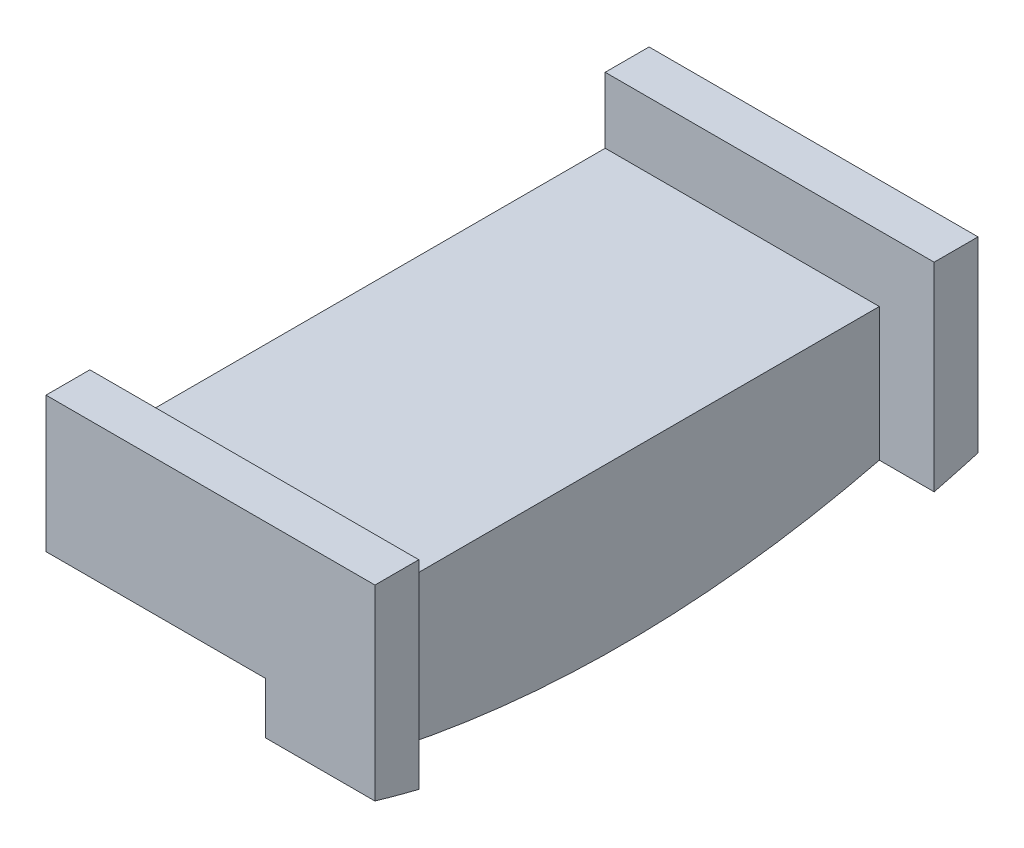
ISO-10303-21;
HEADER;
FILE_DESCRIPTION(('STEP AP214'),'2;1');
FILE_NAME('part.step','',(''),(''),'','','');
FILE_SCHEMA(('AUTOMOTIVE_DESIGN { 1 0 10303 214 1 1 1 1 }'));
ENDSEC;
DATA;
#1=APPLICATION_CONTEXT('core data for automotive mechanical design processes');
#2=APPLICATION_PROTOCOL_DEFINITION('international standard','automotive_design',2000,#1);
#3=PRODUCT_CONTEXT('',#1,'mechanical');
#4=PRODUCT('Part','Part','',(#3));
#5=PRODUCT_RELATED_PRODUCT_CATEGORY('part','',(#4));
#6=PRODUCT_DEFINITION_FORMATION('','',#4);
#7=PRODUCT_DEFINITION_CONTEXT('part definition',#1,'design');
#8=PRODUCT_DEFINITION('design','',#6,#7);
#9=PRODUCT_DEFINITION_SHAPE('','',#8);
#10=(LENGTH_UNIT() NAMED_UNIT(*) SI_UNIT(.MILLI.,.METRE.));
#11=(NAMED_UNIT(*) PLANE_ANGLE_UNIT() SI_UNIT($,.RADIAN.));
#12=(NAMED_UNIT(*) SI_UNIT($,.STERADIAN.) SOLID_ANGLE_UNIT());
#13=UNCERTAINTY_MEASURE_WITH_UNIT(LENGTH_MEASURE(1.E-05),#10,'distance_accuracy_value','');
#14=(GEOMETRIC_REPRESENTATION_CONTEXT(3) GLOBAL_UNCERTAINTY_ASSIGNED_CONTEXT((#13)) GLOBAL_UNIT_ASSIGNED_CONTEXT((#10,
#11,#12)) REPRESENTATION_CONTEXT('',''));
#15=CARTESIAN_POINT('',(0.,0.,0.));
#16=DIRECTION('',(0.,0.,1.));
#17=DIRECTION('',(1.,0.,0.));
#18=AXIS2_PLACEMENT_3D('',#15,#16,#17);
#19=CARTESIAN_POINT('',(26.18,-4.85,-1.375));
#20=DIRECTION('',(0.,0.,1.));
#21=DIRECTION('',(1.,0.,0.));
#22=AXIS2_PLACEMENT_3D('',#19,#20,#21);
#23=PLANE('',#22);
#24=DIRECTION('',(0.,1.,0.));
#25=VECTOR('',#24,1.);
#26=CARTESIAN_POINT('',(26.43,5.675,-1.375));
#27=LINE('',#26,#25);
#28=CARTESIAN_POINT('',(26.43,-4.70312396179391,-1.375));
#29=VERTEX_POINT('',#28);
#30=CARTESIAN_POINT('',(26.43,-4.46822112254978,-1.375));
#31=VERTEX_POINT('',#30);
#32=EDGE_CURVE('E101',#29,#31,#27,.T.);
#33=ORIENTED_EDGE('',*,*,#32,.T.);
#34=DIRECTION('',(1.,0.,0.));
#35=VECTOR('',#34,1.);
#36=CARTESIAN_POINT('',(25.68,-4.46822112254978,-1.375));
#37=LINE('',#36,#35);
#38=CARTESIAN_POINT('',(25.43,-4.46822112254978,-1.375));
#39=VERTEX_POINT('',#38);
#40=EDGE_CURVE('E160',#39,#31,#37,.T.);
#41=ORIENTED_EDGE('',*,*,#40,.F.);
#42=DIRECTION('',(0.,1.,0.));
#43=VECTOR('',#42,1.);
#44=CARTESIAN_POINT('',(25.43,-4.85,-1.375));
#45=LINE('',#44,#43);
#46=CARTESIAN_POINT('',(25.43,-3.85,-1.375));
#47=VERTEX_POINT('',#46);
#48=EDGE_CURVE('E135',#47,#39,#45,.F.);
#49=ORIENTED_EDGE('',*,*,#48,.F.);
#50=DIRECTION('',(1.,0.,0.));
#51=VECTOR('',#50,1.);
#52=CARTESIAN_POINT('',(26.18,-3.85,-1.375));
#53=LINE('',#52,#51);
#54=CARTESIAN_POINT('',(26.93,-3.85,-1.375));
#55=VERTEX_POINT('',#54);
#56=EDGE_CURVE('E139',#47,#55,#53,.T.);
#57=ORIENTED_EDGE('',*,*,#56,.T.);
#58=DIRECTION('',(0.,1.,0.));
#59=VECTOR('',#58,1.);
#60=CARTESIAN_POINT('',(26.93,-4.85,-1.375));
#61=LINE('',#60,#59);
#62=CARTESIAN_POINT('',(26.93,-4.70312396179391,-1.375));
#63=VERTEX_POINT('',#62);
#64=EDGE_CURVE('E162',#63,#55,#61,.T.);
#65=ORIENTED_EDGE('',*,*,#64,.F.);
#66=DIRECTION('',(-1.,0.,0.));
#67=VECTOR('',#66,1.);
#68=CARTESIAN_POINT('',(27.18,-4.70312396179391,-1.375));
#69=LINE('',#68,#67);
#70=EDGE_CURVE('E111',#29,#63,#69,.F.);
#71=ORIENTED_EDGE('',*,*,#70,.F.);
#72=EDGE_LOOP('',(#33,#41,#49,#57,#65,#71));
#73=FACE_BOUND('',#72,.T.);
#74=ADVANCED_FACE('F16',(#73),#23,.F.);
#75=CARTESIAN_POINT('',(26.43,5.675,0.));
#76=DIRECTION('',(1.,0.,0.));
#77=DIRECTION('',(0.,0.,-1.));
#78=AXIS2_PLACEMENT_3D('',#75,#76,#77);
#79=PLANE('',#78);
#80=CARTESIAN_POINT('',(26.43,0.,0.));
#81=DIRECTION('',(-1.,0.,0.));
#82=DIRECTION('',(0.,0.,1.));
#83=AXIS2_PLACEMENT_3D('',#80,#81,#82);
#84=CIRCLE('',#83,4.9);
#85=CARTESIAN_POINT('',(26.43,-4.70312396179391,1.375));
#86=VERTEX_POINT('',#85);
#87=EDGE_CURVE('E19',#86,#29,#84,.F.);
#88=ORIENTED_EDGE('',*,*,#87,.F.);
#89=DIRECTION('',(0.,1.,0.));
#90=VECTOR('',#89,1.);
#91=CARTESIAN_POINT('',(26.43,-4.85,1.375));
#92=LINE('',#91,#90);
#93=CARTESIAN_POINT('',(26.43,-4.46822112254978,1.375));
#94=VERTEX_POINT('',#93);
#95=EDGE_CURVE('E107',#86,#94,#92,.T.);
#96=ORIENTED_EDGE('',*,*,#95,.T.);
#97=CARTESIAN_POINT('',(26.43,0.,0.));
#98=DIRECTION('',(1.,0.,0.));
#99=DIRECTION('',(0.,0.,-1.));
#100=AXIS2_PLACEMENT_3D('',#97,#98,#99);
#101=CIRCLE('',#100,4.675);
#102=EDGE_CURVE('E158',#31,#94,#101,.F.);
#103=ORIENTED_EDGE('',*,*,#102,.F.);
#104=ORIENTED_EDGE('',*,*,#32,.F.);
#105=EDGE_LOOP('',(#88,#96,#103,#104));
#106=FACE_BOUND('',#105,.T.);
#107=ADVANCED_FACE('F106',(#106),#79,.F.);
#108=CARTESIAN_POINT('',(26.18,-4.85,1.375));
#109=DIRECTION('',(0.,0.,-1.));
#110=DIRECTION('',(-1.,0.,0.));
#111=AXIS2_PLACEMENT_3D('',#108,#109,#110);
#112=PLANE('',#111);
#113=DIRECTION('',(0.,1.,0.));
#114=VECTOR('',#113,1.);
#115=CARTESIAN_POINT('',(26.93,-4.85,1.375));
#116=LINE('',#115,#114);
#117=CARTESIAN_POINT('',(26.93,-3.85,1.375));
#118=VERTEX_POINT('',#117);
#119=CARTESIAN_POINT('',(26.93,-4.70312396179391,1.375));
#120=VERTEX_POINT('',#119);
#121=EDGE_CURVE('E157',#118,#120,#116,.F.);
#122=ORIENTED_EDGE('',*,*,#121,.F.);
#123=DIRECTION('',(1.,0.,0.));
#124=VECTOR('',#123,1.);
#125=CARTESIAN_POINT('',(26.18,-3.85,1.375));
#126=LINE('',#125,#124);
#127=CARTESIAN_POINT('',(25.43,-3.85,1.375));
#128=VERTEX_POINT('',#127);
#129=EDGE_CURVE('E159',#118,#128,#126,.F.);
#130=ORIENTED_EDGE('',*,*,#129,.T.);
#131=DIRECTION('',(0.,1.,0.));
#132=VECTOR('',#131,1.);
#133=CARTESIAN_POINT('',(25.43,-4.85,1.375));
#134=LINE('',#133,#132);
#135=CARTESIAN_POINT('',(25.43,-4.46822112254978,1.375));
#136=VERTEX_POINT('',#135);
#137=EDGE_CURVE('E120',#136,#128,#134,.T.);
#138=ORIENTED_EDGE('',*,*,#137,.F.);
#139=DIRECTION('',(1.,0.,0.));
#140=VECTOR('',#139,1.);
#141=CARTESIAN_POINT('',(25.68,-4.46822112254978,1.375));
#142=LINE('',#141,#140);
#143=EDGE_CURVE('E119',#94,#136,#142,.F.);
#144=ORIENTED_EDGE('',*,*,#143,.F.);
#145=ORIENTED_EDGE('',*,*,#95,.F.);
#146=DIRECTION('',(-1.,0.,0.));
#147=VECTOR('',#146,1.);
#148=CARTESIAN_POINT('',(27.18,-4.70312396179391,1.375));
#149=LINE('',#148,#147);
#150=EDGE_CURVE('E112',#120,#86,#149,.T.);
#151=ORIENTED_EDGE('',*,*,#150,.F.);
#152=EDGE_LOOP('',(#122,#130,#138,#144,#145,#151));
#153=FACE_BOUND('',#152,.T.);
#154=ADVANCED_FACE('F115',(#153),#112,.F.);
#155=CARTESIAN_POINT('',(27.18,0.,0.));
#156=DIRECTION('',(-1.,0.,0.));
#157=DIRECTION('',(0.,0.,1.));
#158=AXIS2_PLACEMENT_3D('',#155,#156,#157);
#159=CYLINDRICAL_SURFACE('',#158,4.9);
#160=DIRECTION('',(-1.,0.,0.));
#161=VECTOR('',#160,1.);
#162=CARTESIAN_POINT('',(27.18,-4.75703426516984,-1.175));
#163=LINE('',#162,#161);
#164=CARTESIAN_POINT('',(26.93,-4.75703426516984,-1.175));
#165=VERTEX_POINT('',#164);
#166=CARTESIAN_POINT('',(26.68,-4.75703426516984,-1.175));
#167=VERTEX_POINT('',#166);
#168=EDGE_CURVE('E146',#165,#167,#163,.T.);
#169=ORIENTED_EDGE('',*,*,#168,.T.);
#170=CARTESIAN_POINT('',(26.68,0.,0.));
#171=DIRECTION('',(-1.,0.,0.));
#172=DIRECTION('',(0.,0.,1.));
#173=AXIS2_PLACEMENT_3D('',#170,#171,#172);
#174=CIRCLE('',#173,4.9);
#175=CARTESIAN_POINT('',(26.68,-4.75703426516984,1.175));
#176=VERTEX_POINT('',#175);
#177=EDGE_CURVE('E152',#176,#167,#174,.F.);
#178=ORIENTED_EDGE('',*,*,#177,.F.);
#179=DIRECTION('',(-1.,0.,0.));
#180=VECTOR('',#179,1.);
#181=CARTESIAN_POINT('',(27.18,-4.75703426516984,1.175));
#182=LINE('',#181,#180);
#183=CARTESIAN_POINT('',(26.93,-4.75703426516984,1.175));
#184=VERTEX_POINT('',#183);
#185=EDGE_CURVE('E126',#176,#184,#182,.F.);
#186=ORIENTED_EDGE('',*,*,#185,.T.);
#187=CARTESIAN_POINT('',(26.93,0.,0.));
#188=DIRECTION('',(-1.,0.,0.));
#189=DIRECTION('',(0.,0.,1.));
#190=AXIS2_PLACEMENT_3D('',#187,#188,#189);
#191=CIRCLE('',#190,4.9);
#192=EDGE_CURVE('E124',#120,#184,#191,.F.);
#193=ORIENTED_EDGE('',*,*,#192,.F.);
#194=ORIENTED_EDGE('',*,*,#150,.T.);
#195=ORIENTED_EDGE('',*,*,#87,.T.);
#196=ORIENTED_EDGE('',*,*,#70,.T.);
#197=CARTESIAN_POINT('',(26.93,0.,0.));
#198=DIRECTION('',(-1.,0.,0.));
#199=DIRECTION('',(0.,0.,1.));
#200=AXIS2_PLACEMENT_3D('',#197,#198,#199);
#201=CIRCLE('',#200,4.9);
#202=EDGE_CURVE('E141',#165,#63,#201,.F.);
#203=ORIENTED_EDGE('',*,*,#202,.F.);
#204=EDGE_LOOP('',(#169,#178,#186,#193,#194,#195,#196,#203));
#205=FACE_BOUND('',#204,.T.);
#206=ADVANCED_FACE('F122',(#205),#159,.T.);
#207=CARTESIAN_POINT('',(26.18,-3.85,0.));
#208=DIRECTION('',(0.,-1.,0.));
#209=DIRECTION('',(0.,0.,-1.));
#210=AXIS2_PLACEMENT_3D('',#207,#208,#209);
#211=PLANE('',#210);
#212=DIRECTION('',(0.,0.,-1.));
#213=VECTOR('',#212,1.);
#214=CARTESIAN_POINT('',(26.93,-3.85,0.));
#215=LINE('',#214,#213);
#216=CARTESIAN_POINT('',(26.93,-3.85,-1.175));
#217=VERTEX_POINT('',#216);
#218=EDGE_CURVE('E167',#55,#217,#215,.F.);
#219=ORIENTED_EDGE('',*,*,#218,.F.);
#220=ORIENTED_EDGE('',*,*,#56,.F.);
#221=DIRECTION('',(0.,0.,-1.));
#222=VECTOR('',#221,1.);
#223=CARTESIAN_POINT('',(25.43,-3.85,0.));
#224=LINE('',#223,#222);
#225=CARTESIAN_POINT('',(25.43,-3.85,-1.175));
#226=VERTEX_POINT('',#225);
#227=EDGE_CURVE('E142',#226,#47,#224,.T.);
#228=ORIENTED_EDGE('',*,*,#227,.F.);
#229=DIRECTION('',(1.,0.,0.));
#230=VECTOR('',#229,1.);
#231=CARTESIAN_POINT('',(26.43,-3.85,-1.175));
#232=LINE('',#231,#230);
#233=EDGE_CURVE('E155',#217,#226,#232,.F.);
#234=ORIENTED_EDGE('',*,*,#233,.F.);
#235=EDGE_LOOP('',(#219,#220,#228,#234));
#236=FACE_BOUND('',#235,.T.);
#237=ADVANCED_FACE('F272',(#236),#211,.F.);
#238=CARTESIAN_POINT('',(26.93,-4.85,0.));
#239=DIRECTION('',(1.,0.,0.));
#240=DIRECTION('',(0.,0.,-1.));
#241=AXIS2_PLACEMENT_3D('',#238,#239,#240);
#242=PLANE('',#241);
#243=ORIENTED_EDGE('',*,*,#64,.T.);
#244=ORIENTED_EDGE('',*,*,#218,.T.);
#245=DIRECTION('',(0.,1.,0.));
#246=VECTOR('',#245,1.);
#247=CARTESIAN_POINT('',(26.93,-3.65,-1.175));
#248=LINE('',#247,#246);
#249=EDGE_CURVE('E178',#165,#217,#248,.T.);
#250=ORIENTED_EDGE('',*,*,#249,.F.);
#251=ORIENTED_EDGE('',*,*,#202,.T.);
#252=EDGE_LOOP('',(#243,#244,#250,#251));
#253=FACE_BOUND('',#252,.T.);
#254=ADVANCED_FACE('F273',(#253),#242,.T.);
#255=CARTESIAN_POINT('',(25.68,0.,0.));
#256=DIRECTION('',(1.,0.,0.));
#257=DIRECTION('',(0.,0.,-1.));
#258=AXIS2_PLACEMENT_3D('',#255,#256,#257);
#259=CYLINDRICAL_SURFACE('',#258,4.675);
#260=ORIENTED_EDGE('',*,*,#40,.T.);
#261=ORIENTED_EDGE('',*,*,#102,.T.);
#262=ORIENTED_EDGE('',*,*,#143,.T.);
#263=CARTESIAN_POINT('',(25.43,0.,0.));
#264=DIRECTION('',(1.,0.,0.));
#265=DIRECTION('',(0.,0.,-1.));
#266=AXIS2_PLACEMENT_3D('',#263,#264,#265);
#267=CIRCLE('',#266,4.675);
#268=EDGE_CURVE('E147',#136,#39,#267,.T.);
#269=ORIENTED_EDGE('',*,*,#268,.T.);
#270=EDGE_LOOP('',(#260,#261,#262,#269));
#271=FACE_BOUND('',#270,.T.);
#272=ADVANCED_FACE('F267',(#271),#259,.T.);
#273=CARTESIAN_POINT('',(26.18,-3.85,0.));
#274=DIRECTION('',(0.,-1.,0.));
#275=DIRECTION('',(0.,0.,-1.));
#276=AXIS2_PLACEMENT_3D('',#273,#274,#275);
#277=PLANE('',#276);
#278=DIRECTION('',(0.,0.,-1.));
#279=VECTOR('',#278,1.);
#280=CARTESIAN_POINT('',(25.43,-3.85,0.));
#281=LINE('',#280,#279);
#282=CARTESIAN_POINT('',(25.43,-3.85,1.175));
#283=VERTEX_POINT('',#282);
#284=EDGE_CURVE('E151',#283,#128,#281,.F.);
#285=ORIENTED_EDGE('',*,*,#284,.T.);
#286=ORIENTED_EDGE('',*,*,#129,.F.);
#287=DIRECTION('',(0.,0.,-1.));
#288=VECTOR('',#287,1.);
#289=CARTESIAN_POINT('',(26.93,-3.85,0.));
#290=LINE('',#289,#288);
#291=CARTESIAN_POINT('',(26.93,-3.85,1.175));
#292=VERTEX_POINT('',#291);
#293=EDGE_CURVE('E231',#292,#118,#290,.F.);
#294=ORIENTED_EDGE('',*,*,#293,.F.);
#295=DIRECTION('',(-1.,0.,0.));
#296=VECTOR('',#295,1.);
#297=CARTESIAN_POINT('',(26.43,-3.85,1.175));
#298=LINE('',#297,#296);
#299=EDGE_CURVE('E236',#283,#292,#298,.F.);
#300=ORIENTED_EDGE('',*,*,#299,.F.);
#301=EDGE_LOOP('',(#285,#286,#294,#300));
#302=FACE_BOUND('',#301,.T.);
#303=ADVANCED_FACE('F262',(#302),#277,.F.);
#304=CARTESIAN_POINT('',(26.93,-4.85,0.));
#305=DIRECTION('',(1.,0.,0.));
#306=DIRECTION('',(0.,0.,-1.));
#307=AXIS2_PLACEMENT_3D('',#304,#305,#306);
#308=PLANE('',#307);
#309=ORIENTED_EDGE('',*,*,#121,.T.);
#310=ORIENTED_EDGE('',*,*,#192,.T.);
#311=DIRECTION('',(0.,1.,0.));
#312=VECTOR('',#311,1.);
#313=CARTESIAN_POINT('',(26.93,-3.65,1.175));
#314=LINE('',#313,#312);
#315=EDGE_CURVE('E221',#292,#184,#314,.F.);
#316=ORIENTED_EDGE('',*,*,#315,.F.);
#317=ORIENTED_EDGE('',*,*,#293,.T.);
#318=EDGE_LOOP('',(#309,#310,#316,#317));
#319=FACE_BOUND('',#318,.T.);
#320=ADVANCED_FACE('F298',(#319),#308,.T.);
#321=CARTESIAN_POINT('',(26.68,-6.35,0.));
#322=DIRECTION('',(1.,0.,0.));
#323=DIRECTION('',(0.,0.,-1.));
#324=AXIS2_PLACEMENT_3D('',#321,#322,#323);
#325=PLANE('',#324);
#326=ORIENTED_EDGE('',*,*,#177,.T.);
#327=DIRECTION('',(0.,1.,0.));
#328=VECTOR('',#327,1.);
#329=CARTESIAN_POINT('',(26.68,-3.65,-1.175));
#330=LINE('',#329,#328);
#331=CARTESIAN_POINT('',(26.68,-4.15,-1.175));
#332=VERTEX_POINT('',#331);
#333=EDGE_CURVE('E181',#332,#167,#330,.F.);
#334=ORIENTED_EDGE('',*,*,#333,.F.);
#335=DIRECTION('',(0.,0.,1.));
#336=VECTOR('',#335,1.);
#337=CARTESIAN_POINT('',(26.68,-4.15,0.));
#338=LINE('',#337,#336);
#339=CARTESIAN_POINT('',(26.68,-4.15,1.175));
#340=VERTEX_POINT('',#339);
#341=EDGE_CURVE('E197',#340,#332,#338,.F.);
#342=ORIENTED_EDGE('',*,*,#341,.F.);
#343=DIRECTION('',(0.,1.,0.));
#344=VECTOR('',#343,1.);
#345=CARTESIAN_POINT('',(26.68,-3.65,1.175));
#346=LINE('',#345,#344);
#347=EDGE_CURVE('E213',#176,#340,#346,.T.);
#348=ORIENTED_EDGE('',*,*,#347,.F.);
#349=EDGE_LOOP('',(#326,#334,#342,#348));
#350=FACE_BOUND('',#349,.T.);
#351=ADVANCED_FACE('F209',(#350),#325,.T.);
#352=CARTESIAN_POINT('',(26.43,-3.65,-1.175));
#353=DIRECTION('',(0.,0.,1.));
#354=DIRECTION('',(1.,0.,0.));
#355=AXIS2_PLACEMENT_3D('',#352,#353,#354);
#356=PLANE('',#355);
#357=ORIENTED_EDGE('',*,*,#168,.F.);
#358=ORIENTED_EDGE('',*,*,#249,.T.);
#359=ORIENTED_EDGE('',*,*,#233,.T.);
#360=DIRECTION('',(0.,1.,0.));
#361=VECTOR('',#360,1.);
#362=CARTESIAN_POINT('',(25.43,-4.85,-1.175));
#363=LINE('',#362,#361);
#364=CARTESIAN_POINT('',(25.43,-4.15,-1.175));
#365=VERTEX_POINT('',#364);
#366=EDGE_CURVE('E150',#226,#365,#363,.F.);
#367=ORIENTED_EDGE('',*,*,#366,.T.);
#368=DIRECTION('',(1.,0.,0.));
#369=VECTOR('',#368,1.);
#370=CARTESIAN_POINT('',(26.43,-4.15,-1.175));
#371=LINE('',#370,#369);
#372=EDGE_CURVE('E194',#332,#365,#371,.F.);
#373=ORIENTED_EDGE('',*,*,#372,.F.);
#374=ORIENTED_EDGE('',*,*,#333,.T.);
#375=EDGE_LOOP('',(#357,#358,#359,#367,#373,#374));
#376=FACE_BOUND('',#375,.T.);
#377=ADVANCED_FACE('F214',(#376),#356,.T.);
#378=CARTESIAN_POINT('',(25.43,-4.85,0.));
#379=DIRECTION('',(1.,0.,0.));
#380=DIRECTION('',(0.,0.,-1.));
#381=AXIS2_PLACEMENT_3D('',#378,#379,#380);
#382=PLANE('',#381);
#383=DIRECTION('',(0.,0.,1.));
#384=VECTOR('',#383,1.);
#385=CARTESIAN_POINT('',(25.43,-4.15,0.));
#386=LINE('',#385,#384);
#387=CARTESIAN_POINT('',(25.43,-4.15,1.175));
#388=VERTEX_POINT('',#387);
#389=EDGE_CURVE('E25',#365,#388,#386,.T.);
#390=ORIENTED_EDGE('',*,*,#389,.F.);
#391=ORIENTED_EDGE('',*,*,#366,.F.);
#392=ORIENTED_EDGE('',*,*,#227,.T.);
#393=ORIENTED_EDGE('',*,*,#48,.T.);
#394=ORIENTED_EDGE('',*,*,#268,.F.);
#395=ORIENTED_EDGE('',*,*,#137,.T.);
#396=ORIENTED_EDGE('',*,*,#284,.F.);
#397=DIRECTION('',(0.,1.,0.));
#398=VECTOR('',#397,1.);
#399=CARTESIAN_POINT('',(25.43,-3.65,1.175));
#400=LINE('',#399,#398);
#401=EDGE_CURVE('E34',#388,#283,#400,.T.);
#402=ORIENTED_EDGE('',*,*,#401,.F.);
#403=EDGE_LOOP('',(#390,#391,#392,#393,#394,#395,#396,#402));
#404=FACE_BOUND('',#403,.T.);
#405=ADVANCED_FACE('F263',(#404),#382,.F.);
#406=CARTESIAN_POINT('',(26.43,-3.65,1.175));
#407=DIRECTION('',(0.,0.,-1.));
#408=DIRECTION('',(-1.,0.,0.));
#409=AXIS2_PLACEMENT_3D('',#406,#407,#408);
#410=PLANE('',#409);
#411=ORIENTED_EDGE('',*,*,#185,.F.);
#412=ORIENTED_EDGE('',*,*,#347,.T.);
#413=DIRECTION('',(1.,0.,0.));
#414=VECTOR('',#413,1.);
#415=CARTESIAN_POINT('',(26.43,-4.15,1.175));
#416=LINE('',#415,#414);
#417=EDGE_CURVE('E11',#388,#340,#416,.T.);
#418=ORIENTED_EDGE('',*,*,#417,.F.);
#419=ORIENTED_EDGE('',*,*,#401,.T.);
#420=ORIENTED_EDGE('',*,*,#299,.T.);
#421=ORIENTED_EDGE('',*,*,#315,.T.);
#422=EDGE_LOOP('',(#411,#412,#418,#419,#420,#421));
#423=FACE_BOUND('',#422,.T.);
#424=ADVANCED_FACE('F284',(#423),#410,.T.);
#425=CARTESIAN_POINT('',(26.43,-4.15,0.));
#426=DIRECTION('',(0.,1.,0.));
#427=DIRECTION('',(0.,0.,1.));
#428=AXIS2_PLACEMENT_3D('',#425,#426,#427);
#429=PLANE('',#428);
#430=ORIENTED_EDGE('',*,*,#389,.T.);
#431=ORIENTED_EDGE('',*,*,#417,.T.);
#432=ORIENTED_EDGE('',*,*,#341,.T.);
#433=ORIENTED_EDGE('',*,*,#372,.T.);
#434=EDGE_LOOP('',(#430,#431,#432,#433));
#435=FACE_BOUND('',#434,.T.);
#436=ADVANCED_FACE('F219',(#435),#429,.T.);
#437=CLOSED_SHELL('',(#74,#107,#154,#206,#237,#254,#272,#303,#320,#351,#377,#405,#424,#436));
#438=MANIFOLD_SOLID_BREP('B1',#437);
#439=ADVANCED_BREP_SHAPE_REPRESENTATION('',(#18,#438),#14);
#440=SHAPE_DEFINITION_REPRESENTATION(#9,#439);
ENDSEC;
END-ISO-10303-21;
